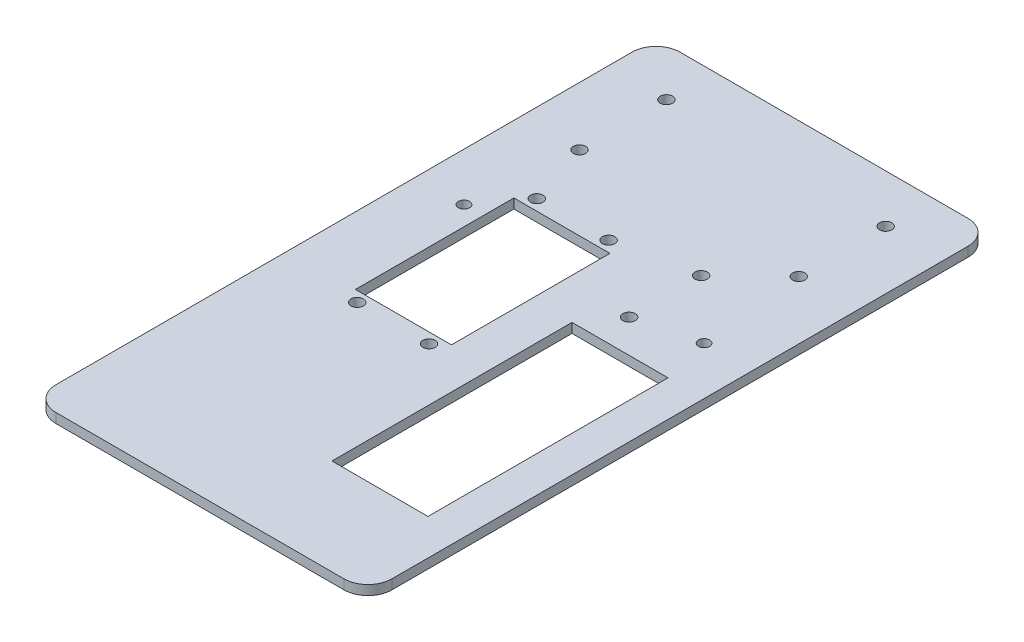
ISO-10303-21;
HEADER;
FILE_DESCRIPTION(('STEP AP214'),'2;1');
FILE_NAME('part.step','',(''),(''),'','','');
FILE_SCHEMA(('AUTOMOTIVE_DESIGN { 1 0 10303 214 1 1 1 1 }'));
ENDSEC;
DATA;
#1=APPLICATION_CONTEXT('core data for automotive mechanical design processes');
#2=APPLICATION_PROTOCOL_DEFINITION('international standard','automotive_design',2000,#1);
#3=PRODUCT_CONTEXT('',#1,'mechanical');
#4=PRODUCT('Part','Part','',(#3));
#5=PRODUCT_RELATED_PRODUCT_CATEGORY('part','',(#4));
#6=PRODUCT_DEFINITION_FORMATION('','',#4);
#7=PRODUCT_DEFINITION_CONTEXT('part definition',#1,'design');
#8=PRODUCT_DEFINITION('design','',#6,#7);
#9=PRODUCT_DEFINITION_SHAPE('','',#8);
#10=(LENGTH_UNIT() NAMED_UNIT(*) SI_UNIT(.MILLI.,.METRE.));
#11=(NAMED_UNIT(*) PLANE_ANGLE_UNIT() SI_UNIT($,.RADIAN.));
#12=(NAMED_UNIT(*) SI_UNIT($,.STERADIAN.) SOLID_ANGLE_UNIT());
#13=UNCERTAINTY_MEASURE_WITH_UNIT(LENGTH_MEASURE(1.E-05),#10,'distance_accuracy_value','');
#14=(GEOMETRIC_REPRESENTATION_CONTEXT(3) GLOBAL_UNCERTAINTY_ASSIGNED_CONTEXT((#13)) GLOBAL_UNIT_ASSIGNED_CONTEXT((#10,
#11,#12)) REPRESENTATION_CONTEXT('',''));
#15=CARTESIAN_POINT('',(0.,0.,0.));
#16=DIRECTION('',(0.,0.,1.));
#17=DIRECTION('',(1.,0.,0.));
#18=AXIS2_PLACEMENT_3D('',#15,#16,#17);
#19=CARTESIAN_POINT('',(0.,2.54,0.));
#20=DIRECTION('',(0.,1.,0.));
#21=DIRECTION('',(0.,0.,1.));
#22=AXIS2_PLACEMENT_3D('',#19,#20,#21);
#23=PLANE('',#22);
#24=DIRECTION('',(1.,0.,0.));
#25=VECTOR('',#24,1.);
#26=CARTESIAN_POINT('',(-26.67,2.54,14.745));
#27=LINE('',#26,#25);
#28=CARTESIAN_POINT('',(-26.67,2.54,14.745));
#29=VERTEX_POINT('',#28);
#30=CARTESIAN_POINT('',(-1.26999999999998,2.54,14.745));
#31=VERTEX_POINT('',#30);
#32=EDGE_CURVE('E58',#29,#31,#27,.T.);
#33=ORIENTED_EDGE('',*,*,#32,.F.);
#34=DIRECTION('',(0.,0.,1.));
#35=VECTOR('',#34,1.);
#36=CARTESIAN_POINT('',(-26.67,2.54,-27.165));
#37=LINE('',#36,#35);
#38=CARTESIAN_POINT('',(-26.67,2.54,-27.165));
#39=VERTEX_POINT('',#38);
#40=EDGE_CURVE('E193',#39,#29,#37,.T.);
#41=ORIENTED_EDGE('',*,*,#40,.F.);
#42=DIRECTION('',(1.,0.,0.));
#43=VECTOR('',#42,1.);
#44=CARTESIAN_POINT('',(-26.67,2.54,-27.165));
#45=LINE('',#44,#43);
#46=CARTESIAN_POINT('',(-1.26999999999999,2.54,-27.165));
#47=VERTEX_POINT('',#46);
#48=EDGE_CURVE('E201',#39,#47,#45,.T.);
#49=ORIENTED_EDGE('',*,*,#48,.T.);
#50=DIRECTION('',(0.,0.,1.));
#51=VECTOR('',#50,1.);
#52=CARTESIAN_POINT('',(-1.26999999999999,2.54,-27.165));
#53=LINE('',#52,#51);
#54=EDGE_CURVE('E204',#47,#31,#53,.T.);
#55=ORIENTED_EDGE('',*,*,#54,.T.);
#56=EDGE_LOOP('',(#33,#41,#49,#55));
#57=FACE_BOUND('',#56,.T.);
#58=CARTESIAN_POINT('',(-29.,2.54,-69.85));
#59=DIRECTION('',(0.,1.,0.));
#60=DIRECTION('',(0.,0.,1.));
#61=AXIS2_PLACEMENT_3D('',#58,#59,#60);
#62=CIRCLE('',#61,1.63194999999999);
#63=CARTESIAN_POINT('',(-29.,2.54,-68.21805));
#64=VERTEX_POINT('',#63);
#65=EDGE_CURVE('E164',#64,#64,#62,.T.);
#66=ORIENTED_EDGE('',*,*,#65,.F.);
#67=EDGE_LOOP('',(#66));
#68=FACE_BOUND('',#67,.T.);
#69=CARTESIAN_POINT('',(29.,2.54,-69.85));
#70=DIRECTION('',(0.,1.,0.));
#71=DIRECTION('',(0.,0.,1.));
#72=AXIS2_PLACEMENT_3D('',#69,#70,#71);
#73=CIRCLE('',#72,1.63194999999999);
#74=CARTESIAN_POINT('',(29.,2.54,-68.21805));
#75=VERTEX_POINT('',#74);
#76=EDGE_CURVE('E220',#75,#75,#73,.T.);
#77=ORIENTED_EDGE('',*,*,#76,.F.);
#78=EDGE_LOOP('',(#77));
#79=FACE_BOUND('',#78,.T.);
#80=CARTESIAN_POINT('',(29.,2.54,-46.85));
#81=DIRECTION('',(0.,1.,0.));
#82=DIRECTION('',(0.,0.,1.));
#83=AXIS2_PLACEMENT_3D('',#80,#81,#82);
#84=CIRCLE('',#83,1.63194999999999);
#85=CARTESIAN_POINT('',(29.,2.54,-45.21805));
#86=VERTEX_POINT('',#85);
#87=EDGE_CURVE('E226',#86,#86,#84,.T.);
#88=ORIENTED_EDGE('',*,*,#87,.F.);
#89=EDGE_LOOP('',(#88));
#90=FACE_BOUND('',#89,.T.);
#91=CARTESIAN_POINT('',(-29.,2.54,-46.85));
#92=DIRECTION('',(0.,1.,0.));
#93=DIRECTION('',(0.,0.,1.));
#94=AXIS2_PLACEMENT_3D('',#91,#92,#93);
#95=CIRCLE('',#94,1.63194999999999);
#96=CARTESIAN_POINT('',(-29.,2.54,-45.21805));
#97=VERTEX_POINT('',#96);
#98=EDGE_CURVE('E232',#97,#97,#95,.T.);
#99=ORIENTED_EDGE('',*,*,#98,.F.);
#100=EDGE_LOOP('',(#99));
#101=FACE_BOUND('',#100,.T.);
#102=CARTESIAN_POINT('',(-23.47,2.54,-30.0225));
#103=DIRECTION('',(0.,1.,0.));
#104=DIRECTION('',(0.,0.,1.));
#105=AXIS2_PLACEMENT_3D('',#102,#103,#104);
#106=CIRCLE('',#105,1.63194999999999);
#107=CARTESIAN_POINT('',(-23.47,2.54,-28.39055));
#108=VERTEX_POINT('',#107);
#109=EDGE_CURVE('E238',#108,#108,#106,.T.);
#110=ORIENTED_EDGE('',*,*,#109,.F.);
#111=EDGE_LOOP('',(#110));
#112=FACE_BOUND('',#111,.T.);
#113=CARTESIAN_POINT('',(-4.46999999999999,2.54,-30.0225));
#114=DIRECTION('',(0.,1.,0.));
#115=DIRECTION('',(0.,0.,1.));
#116=AXIS2_PLACEMENT_3D('',#113,#114,#115);
#117=CIRCLE('',#116,1.63194999999999);
#118=CARTESIAN_POINT('',(-4.46999999999999,2.54,-28.39055));
#119=VERTEX_POINT('',#118);
#120=EDGE_CURVE('E244',#119,#119,#117,.T.);
#121=ORIENTED_EDGE('',*,*,#120,.F.);
#122=EDGE_LOOP('',(#121));
#123=FACE_BOUND('',#122,.T.);
#124=CARTESIAN_POINT('',(-4.46999999999998,2.54,17.4775));
#125=DIRECTION('',(0.,1.,0.));
#126=DIRECTION('',(0.,0.,1.));
#127=AXIS2_PLACEMENT_3D('',#124,#125,#126);
#128=CIRCLE('',#127,1.63194999999999);
#129=CARTESIAN_POINT('',(-4.46999999999998,2.54,19.10945));
#130=VERTEX_POINT('',#129);
#131=EDGE_CURVE('E250',#130,#130,#128,.T.);
#132=ORIENTED_EDGE('',*,*,#131,.F.);
#133=EDGE_LOOP('',(#132));
#134=FACE_BOUND('',#133,.T.);
#135=CARTESIAN_POINT('',(-23.47,2.54,17.4775));
#136=DIRECTION('',(0.,1.,0.));
#137=DIRECTION('',(0.,0.,1.));
#138=AXIS2_PLACEMENT_3D('',#135,#136,#137);
#139=CIRCLE('',#138,1.63194999999999);
#140=CARTESIAN_POINT('',(-23.47,2.54,19.10945));
#141=VERTEX_POINT('',#140);
#142=EDGE_CURVE('E256',#141,#141,#139,.T.);
#143=ORIENTED_EDGE('',*,*,#142,.F.);
#144=EDGE_LOOP('',(#143));
#145=FACE_BOUND('',#144,.T.);
#146=CARTESIAN_POINT('',(15.875,2.54,-34.15));
#147=DIRECTION('',(0.,1.,0.));
#148=DIRECTION('',(0.,0.,1.));
#149=AXIS2_PLACEMENT_3D('',#146,#147,#148);
#150=CIRCLE('',#149,1.63194999999999);
#151=CARTESIAN_POINT('',(15.875,2.54,-32.51805));
#152=VERTEX_POINT('',#151);
#153=EDGE_CURVE('E262',#152,#152,#150,.T.);
#154=ORIENTED_EDGE('',*,*,#153,.F.);
#155=EDGE_LOOP('',(#154));
#156=FACE_BOUND('',#155,.T.);
#157=CARTESIAN_POINT('',(15.875,2.54,-15.1));
#158=DIRECTION('',(0.,1.,0.));
#159=DIRECTION('',(0.,0.,1.));
#160=AXIS2_PLACEMENT_3D('',#157,#158,#159);
#161=CIRCLE('',#160,1.63194999999999);
#162=CARTESIAN_POINT('',(15.875,2.54,-13.46805));
#163=VERTEX_POINT('',#162);
#164=EDGE_CURVE('E268',#163,#163,#161,.T.);
#165=ORIENTED_EDGE('',*,*,#164,.F.);
#166=EDGE_LOOP('',(#165));
#167=FACE_BOUND('',#166,.T.);
#168=CARTESIAN_POINT('',(31.75,2.54,-19.05));
#169=DIRECTION('',(0.,1.,0.));
#170=DIRECTION('',(0.,0.,1.));
#171=AXIS2_PLACEMENT_3D('',#168,#169,#170);
#172=CIRCLE('',#171,1.4732);
#173=CARTESIAN_POINT('',(31.75,2.54,-17.5768));
#174=VERTEX_POINT('',#173);
#175=EDGE_CURVE('E275',#174,#174,#172,.T.);
#176=ORIENTED_EDGE('',*,*,#175,.F.);
#177=EDGE_LOOP('',(#176));
#178=FACE_BOUND('',#177,.T.);
#179=CARTESIAN_POINT('',(-31.75,2.54,-19.05));
#180=DIRECTION('',(0.,1.,0.));
#181=DIRECTION('',(0.,0.,1.));
#182=AXIS2_PLACEMENT_3D('',#179,#180,#181);
#183=CIRCLE('',#182,1.4732);
#184=CARTESIAN_POINT('',(-31.75,2.54,-17.5768));
#185=VERTEX_POINT('',#184);
#186=EDGE_CURVE('E278',#185,#185,#183,.T.);
#187=ORIENTED_EDGE('',*,*,#186,.F.);
#188=EDGE_LOOP('',(#187));
#189=FACE_BOUND('',#188,.T.);
#190=CARTESIAN_POINT('',(-38.1,2.54,-76.2));
#191=DIRECTION('',(0.,1.,0.));
#192=DIRECTION('',(0.,0.,1.));
#193=AXIS2_PLACEMENT_3D('',#190,#191,#192);
#194=CIRCLE('',#193,6.35);
#195=CARTESIAN_POINT('',(-44.45,2.54,-76.1999999999999));
#196=VERTEX_POINT('',#195);
#197=CARTESIAN_POINT('',(-38.0999999999999,2.54,-82.55));
#198=VERTEX_POINT('',#197);
#199=EDGE_CURVE('E282',#196,#198,#194,.F.);
#200=ORIENTED_EDGE('',*,*,#199,.F.);
#201=DIRECTION('',(0.,0.,-1.));
#202=VECTOR('',#201,1.);
#203=CARTESIAN_POINT('',(-44.45,2.54,0.));
#204=LINE('',#203,#202);
#205=CARTESIAN_POINT('',(-44.45,2.54,76.2));
#206=VERTEX_POINT('',#205);
#207=EDGE_CURVE('E285',#206,#196,#204,.T.);
#208=ORIENTED_EDGE('',*,*,#207,.F.);
#209=CARTESIAN_POINT('',(-38.1,2.54,76.2));
#210=DIRECTION('',(0.,1.,0.));
#211=DIRECTION('',(0.,0.,1.));
#212=AXIS2_PLACEMENT_3D('',#209,#210,#211);
#213=CIRCLE('',#212,6.35);
#214=CARTESIAN_POINT('',(-38.0999999999999,2.54,82.55));
#215=VERTEX_POINT('',#214);
#216=EDGE_CURVE('E288',#215,#206,#213,.F.);
#217=ORIENTED_EDGE('',*,*,#216,.F.);
#218=DIRECTION('',(1.,0.,0.));
#219=VECTOR('',#218,1.);
#220=CARTESIAN_POINT('',(0.,2.54,82.55));
#221=LINE('',#220,#219);
#222=CARTESIAN_POINT('',(38.1,2.54,82.55));
#223=VERTEX_POINT('',#222);
#224=EDGE_CURVE('E291',#215,#223,#221,.T.);
#225=ORIENTED_EDGE('',*,*,#224,.T.);
#226=CARTESIAN_POINT('',(38.1,2.54,76.2));
#227=DIRECTION('',(0.,1.,0.));
#228=DIRECTION('',(0.,0.,1.));
#229=AXIS2_PLACEMENT_3D('',#226,#227,#228);
#230=CIRCLE('',#229,6.35);
#231=CARTESIAN_POINT('',(44.45,2.54,76.2));
#232=VERTEX_POINT('',#231);
#233=EDGE_CURVE('E294',#223,#232,#230,.T.);
#234=ORIENTED_EDGE('',*,*,#233,.T.);
#235=DIRECTION('',(0.,0.,-1.));
#236=VECTOR('',#235,1.);
#237=CARTESIAN_POINT('',(44.45,2.54,0.));
#238=LINE('',#237,#236);
#239=CARTESIAN_POINT('',(44.45,2.54,-76.1999999999999));
#240=VERTEX_POINT('',#239);
#241=EDGE_CURVE('E297',#232,#240,#238,.T.);
#242=ORIENTED_EDGE('',*,*,#241,.T.);
#243=CARTESIAN_POINT('',(38.1,2.54,-76.2));
#244=DIRECTION('',(0.,1.,0.));
#245=DIRECTION('',(0.,0.,1.));
#246=AXIS2_PLACEMENT_3D('',#243,#244,#245);
#247=CIRCLE('',#246,6.35);
#248=CARTESIAN_POINT('',(38.1,2.54,-82.55));
#249=VERTEX_POINT('',#248);
#250=EDGE_CURVE('E299',#249,#240,#247,.F.);
#251=ORIENTED_EDGE('',*,*,#250,.F.);
#252=DIRECTION('',(1.,0.,0.));
#253=VECTOR('',#252,1.);
#254=CARTESIAN_POINT('',(0.,2.54,-82.55));
#255=LINE('',#254,#253);
#256=EDGE_CURVE('E302',#198,#249,#255,.T.);
#257=ORIENTED_EDGE('',*,*,#256,.F.);
#258=EDGE_LOOP('',(#200,#208,#217,#225,#234,#242,#251,#257));
#259=FACE_BOUND('',#258,.T.);
#260=DIRECTION('',(0.,0.,1.));
#261=VECTOR('',#260,1.);
#262=CARTESIAN_POINT('',(9.525,2.54,-6.34999999999999));
#263=LINE('',#262,#261);
#264=CARTESIAN_POINT('',(9.525,2.54,-6.34999999999999));
#265=VERTEX_POINT('',#264);
#266=CARTESIAN_POINT('',(9.52500000000001,2.54,57.15));
#267=VERTEX_POINT('',#266);
#268=EDGE_CURVE('E156',#265,#267,#263,.T.);
#269=ORIENTED_EDGE('',*,*,#268,.F.);
#270=DIRECTION('',(1.,0.,0.));
#271=VECTOR('',#270,1.);
#272=CARTESIAN_POINT('',(9.525,2.54,-6.34999999999999));
#273=LINE('',#272,#271);
#274=CARTESIAN_POINT('',(34.925,2.54,-6.34999999999999));
#275=VERTEX_POINT('',#274);
#276=EDGE_CURVE('E50',#265,#275,#273,.T.);
#277=ORIENTED_EDGE('',*,*,#276,.T.);
#278=DIRECTION('',(0.,0.,1.));
#279=VECTOR('',#278,1.);
#280=CARTESIAN_POINT('',(34.925,2.54,-6.34999999999999));
#281=LINE('',#280,#279);
#282=CARTESIAN_POINT('',(34.925,2.54,57.15));
#283=VERTEX_POINT('',#282);
#284=EDGE_CURVE('E171',#275,#283,#281,.T.);
#285=ORIENTED_EDGE('',*,*,#284,.T.);
#286=DIRECTION('',(1.,0.,0.));
#287=VECTOR('',#286,1.);
#288=CARTESIAN_POINT('',(9.52500000000001,2.54,57.15));
#289=LINE('',#288,#287);
#290=EDGE_CURVE('E179',#267,#283,#289,.T.);
#291=ORIENTED_EDGE('',*,*,#290,.F.);
#292=EDGE_LOOP('',(#269,#277,#285,#291));
#293=FACE_BOUND('',#292,.T.);
#294=ADVANCED_FACE('F35',(#57,#68,#79,#90,#101,#112,#123,#134,#145,#156,#167,#178,#189,#259,
#293),#23,.T.);
#295=CARTESIAN_POINT('',(0.,0.,0.));
#296=DIRECTION('',(0.,1.,0.));
#297=DIRECTION('',(0.,0.,1.));
#298=AXIS2_PLACEMENT_3D('',#295,#296,#297);
#299=PLANE('',#298);
#300=CARTESIAN_POINT('',(-38.1,0.,-76.2));
#301=DIRECTION('',(0.,1.,0.));
#302=DIRECTION('',(0.,0.,1.));
#303=AXIS2_PLACEMENT_3D('',#300,#301,#302);
#304=CIRCLE('',#303,6.35);
#305=CARTESIAN_POINT('',(-44.45,0.,-76.1999999999999));
#306=VERTEX_POINT('',#305);
#307=CARTESIAN_POINT('',(-38.0999999999999,0.,-82.55));
#308=VERTEX_POINT('',#307);
#309=EDGE_CURVE('E311',#306,#308,#304,.F.);
#310=ORIENTED_EDGE('',*,*,#309,.T.);
#311=DIRECTION('',(1.,0.,0.));
#312=VECTOR('',#311,1.);
#313=CARTESIAN_POINT('',(0.,0.,-82.55));
#314=LINE('',#313,#312);
#315=CARTESIAN_POINT('',(38.1,0.,-82.55));
#316=VERTEX_POINT('',#315);
#317=EDGE_CURVE('E279',#308,#316,#314,.T.);
#318=ORIENTED_EDGE('',*,*,#317,.T.);
#319=CARTESIAN_POINT('',(38.1,0.,-76.2));
#320=DIRECTION('',(0.,1.,0.));
#321=DIRECTION('',(0.,0.,1.));
#322=AXIS2_PLACEMENT_3D('',#319,#320,#321);
#323=CIRCLE('',#322,6.35);
#324=CARTESIAN_POINT('',(44.45,0.,-76.1999999999999));
#325=VERTEX_POINT('',#324);
#326=EDGE_CURVE('E329',#316,#325,#323,.F.);
#327=ORIENTED_EDGE('',*,*,#326,.T.);
#328=DIRECTION('',(0.,0.,-1.));
#329=VECTOR('',#328,1.);
#330=CARTESIAN_POINT('',(44.45,0.,0.));
#331=LINE('',#330,#329);
#332=CARTESIAN_POINT('',(44.45,0.,76.2));
#333=VERTEX_POINT('',#332);
#334=EDGE_CURVE('E326',#333,#325,#331,.T.);
#335=ORIENTED_EDGE('',*,*,#334,.F.);
#336=CARTESIAN_POINT('',(38.1,0.,76.2));
#337=DIRECTION('',(0.,1.,0.));
#338=DIRECTION('',(0.,0.,1.));
#339=AXIS2_PLACEMENT_3D('',#336,#337,#338);
#340=CIRCLE('',#339,6.35);
#341=CARTESIAN_POINT('',(38.1,0.,82.55));
#342=VERTEX_POINT('',#341);
#343=EDGE_CURVE('E323',#342,#333,#340,.T.);
#344=ORIENTED_EDGE('',*,*,#343,.F.);
#345=DIRECTION('',(1.,0.,0.));
#346=VECTOR('',#345,1.);
#347=CARTESIAN_POINT('',(0.,0.,82.55));
#348=LINE('',#347,#346);
#349=CARTESIAN_POINT('',(-38.0999999999999,0.,82.55));
#350=VERTEX_POINT('',#349);
#351=EDGE_CURVE('E320',#350,#342,#348,.T.);
#352=ORIENTED_EDGE('',*,*,#351,.F.);
#353=CARTESIAN_POINT('',(-38.1,0.,76.2));
#354=DIRECTION('',(0.,1.,0.));
#355=DIRECTION('',(0.,0.,1.));
#356=AXIS2_PLACEMENT_3D('',#353,#354,#355);
#357=CIRCLE('',#356,6.35);
#358=CARTESIAN_POINT('',(-44.45,0.,76.2));
#359=VERTEX_POINT('',#358);
#360=EDGE_CURVE('E317',#350,#359,#357,.F.);
#361=ORIENTED_EDGE('',*,*,#360,.T.);
#362=DIRECTION('',(0.,0.,-1.));
#363=VECTOR('',#362,1.);
#364=CARTESIAN_POINT('',(-44.45,0.,0.));
#365=LINE('',#364,#363);
#366=EDGE_CURVE('E314',#359,#306,#365,.T.);
#367=ORIENTED_EDGE('',*,*,#366,.T.);
#368=EDGE_LOOP('',(#310,#318,#327,#335,#344,#352,#361,#367));
#369=FACE_BOUND('',#368,.T.);
#370=CARTESIAN_POINT('',(-31.75,0.,-19.05));
#371=DIRECTION('',(0.,1.,0.));
#372=DIRECTION('',(0.,0.,1.));
#373=AXIS2_PLACEMENT_3D('',#370,#371,#372);
#374=CIRCLE('',#373,1.4732);
#375=CARTESIAN_POINT('',(-31.75,0.,-17.5768));
#376=VERTEX_POINT('',#375);
#377=EDGE_CURVE('E308',#376,#376,#374,.T.);
#378=ORIENTED_EDGE('',*,*,#377,.T.);
#379=EDGE_LOOP('',(#378));
#380=FACE_BOUND('',#379,.T.);
#381=CARTESIAN_POINT('',(31.75,0.,-19.05));
#382=DIRECTION('',(0.,1.,0.));
#383=DIRECTION('',(0.,0.,1.));
#384=AXIS2_PLACEMENT_3D('',#381,#382,#383);
#385=CIRCLE('',#384,1.4732);
#386=CARTESIAN_POINT('',(31.75,0.,-17.5768));
#387=VERTEX_POINT('',#386);
#388=EDGE_CURVE('E274',#387,#387,#385,.T.);
#389=ORIENTED_EDGE('',*,*,#388,.T.);
#390=EDGE_LOOP('',(#389));
#391=FACE_BOUND('',#390,.T.);
#392=CARTESIAN_POINT('',(15.875,0.,-15.1));
#393=DIRECTION('',(0.,1.,0.));
#394=DIRECTION('',(0.,0.,1.));
#395=AXIS2_PLACEMENT_3D('',#392,#393,#394);
#396=CIRCLE('',#395,1.63194999999999);
#397=CARTESIAN_POINT('',(15.875,0.,-13.46805));
#398=VERTEX_POINT('',#397);
#399=EDGE_CURVE('E271',#398,#398,#396,.T.);
#400=ORIENTED_EDGE('',*,*,#399,.T.);
#401=EDGE_LOOP('',(#400));
#402=FACE_BOUND('',#401,.T.);
#403=CARTESIAN_POINT('',(15.875,0.,-34.15));
#404=DIRECTION('',(0.,1.,0.));
#405=DIRECTION('',(0.,0.,1.));
#406=AXIS2_PLACEMENT_3D('',#403,#404,#405);
#407=CIRCLE('',#406,1.63194999999999);
#408=CARTESIAN_POINT('',(15.875,0.,-32.51805));
#409=VERTEX_POINT('',#408);
#410=EDGE_CURVE('E265',#409,#409,#407,.T.);
#411=ORIENTED_EDGE('',*,*,#410,.T.);
#412=EDGE_LOOP('',(#411));
#413=FACE_BOUND('',#412,.T.);
#414=CARTESIAN_POINT('',(-23.47,0.,17.4775));
#415=DIRECTION('',(0.,1.,0.));
#416=DIRECTION('',(0.,0.,1.));
#417=AXIS2_PLACEMENT_3D('',#414,#415,#416);
#418=CIRCLE('',#417,1.63194999999999);
#419=CARTESIAN_POINT('',(-23.47,0.,19.10945));
#420=VERTEX_POINT('',#419);
#421=EDGE_CURVE('E259',#420,#420,#418,.T.);
#422=ORIENTED_EDGE('',*,*,#421,.T.);
#423=EDGE_LOOP('',(#422));
#424=FACE_BOUND('',#423,.T.);
#425=CARTESIAN_POINT('',(-4.46999999999998,0.,17.4775));
#426=DIRECTION('',(0.,1.,0.));
#427=DIRECTION('',(0.,0.,1.));
#428=AXIS2_PLACEMENT_3D('',#425,#426,#427);
#429=CIRCLE('',#428,1.63194999999999);
#430=CARTESIAN_POINT('',(-4.46999999999998,0.,19.10945));
#431=VERTEX_POINT('',#430);
#432=EDGE_CURVE('E253',#431,#431,#429,.T.);
#433=ORIENTED_EDGE('',*,*,#432,.T.);
#434=EDGE_LOOP('',(#433));
#435=FACE_BOUND('',#434,.T.);
#436=CARTESIAN_POINT('',(-4.46999999999999,0.,-30.0225));
#437=DIRECTION('',(0.,1.,0.));
#438=DIRECTION('',(0.,0.,1.));
#439=AXIS2_PLACEMENT_3D('',#436,#437,#438);
#440=CIRCLE('',#439,1.63194999999999);
#441=CARTESIAN_POINT('',(-4.46999999999999,0.,-28.39055));
#442=VERTEX_POINT('',#441);
#443=EDGE_CURVE('E247',#442,#442,#440,.T.);
#444=ORIENTED_EDGE('',*,*,#443,.T.);
#445=EDGE_LOOP('',(#444));
#446=FACE_BOUND('',#445,.T.);
#447=CARTESIAN_POINT('',(-23.47,0.,-30.0225));
#448=DIRECTION('',(0.,1.,0.));
#449=DIRECTION('',(0.,0.,1.));
#450=AXIS2_PLACEMENT_3D('',#447,#448,#449);
#451=CIRCLE('',#450,1.63194999999999);
#452=CARTESIAN_POINT('',(-23.47,0.,-28.39055));
#453=VERTEX_POINT('',#452);
#454=EDGE_CURVE('E241',#453,#453,#451,.T.);
#455=ORIENTED_EDGE('',*,*,#454,.T.);
#456=EDGE_LOOP('',(#455));
#457=FACE_BOUND('',#456,.T.);
#458=CARTESIAN_POINT('',(-29.,0.,-46.85));
#459=DIRECTION('',(0.,1.,0.));
#460=DIRECTION('',(0.,0.,1.));
#461=AXIS2_PLACEMENT_3D('',#458,#459,#460);
#462=CIRCLE('',#461,1.63194999999999);
#463=CARTESIAN_POINT('',(-29.,0.,-45.21805));
#464=VERTEX_POINT('',#463);
#465=EDGE_CURVE('E235',#464,#464,#462,.T.);
#466=ORIENTED_EDGE('',*,*,#465,.T.);
#467=EDGE_LOOP('',(#466));
#468=FACE_BOUND('',#467,.T.);
#469=CARTESIAN_POINT('',(29.,0.,-46.85));
#470=DIRECTION('',(0.,1.,0.));
#471=DIRECTION('',(0.,0.,1.));
#472=AXIS2_PLACEMENT_3D('',#469,#470,#471);
#473=CIRCLE('',#472,1.63194999999999);
#474=CARTESIAN_POINT('',(29.,0.,-45.21805));
#475=VERTEX_POINT('',#474);
#476=EDGE_CURVE('E229',#475,#475,#473,.T.);
#477=ORIENTED_EDGE('',*,*,#476,.T.);
#478=EDGE_LOOP('',(#477));
#479=FACE_BOUND('',#478,.T.);
#480=CARTESIAN_POINT('',(29.,0.,-69.85));
#481=DIRECTION('',(0.,1.,0.));
#482=DIRECTION('',(0.,0.,1.));
#483=AXIS2_PLACEMENT_3D('',#480,#481,#482);
#484=CIRCLE('',#483,1.63194999999999);
#485=CARTESIAN_POINT('',(29.,0.,-68.21805));
#486=VERTEX_POINT('',#485);
#487=EDGE_CURVE('E223',#486,#486,#484,.T.);
#488=ORIENTED_EDGE('',*,*,#487,.T.);
#489=EDGE_LOOP('',(#488));
#490=FACE_BOUND('',#489,.T.);
#491=CARTESIAN_POINT('',(-29.,0.,-69.85));
#492=DIRECTION('',(0.,1.,0.));
#493=DIRECTION('',(0.,0.,1.));
#494=AXIS2_PLACEMENT_3D('',#491,#492,#493);
#495=CIRCLE('',#494,1.63194999999999);
#496=CARTESIAN_POINT('',(-29.,0.,-68.21805));
#497=VERTEX_POINT('',#496);
#498=EDGE_CURVE('E217',#497,#497,#495,.T.);
#499=ORIENTED_EDGE('',*,*,#498,.T.);
#500=EDGE_LOOP('',(#499));
#501=FACE_BOUND('',#500,.T.);
#502=DIRECTION('',(0.,0.,-1.));
#503=VECTOR('',#502,1.);
#504=CARTESIAN_POINT('',(-26.67,0.,-27.165));
#505=LINE('',#504,#503);
#506=CARTESIAN_POINT('',(-26.67,0.,14.745));
#507=VERTEX_POINT('',#506);
#508=CARTESIAN_POINT('',(-26.67,0.,-27.165));
#509=VERTEX_POINT('',#508);
#510=EDGE_CURVE('E210',#507,#509,#505,.T.);
#511=ORIENTED_EDGE('',*,*,#510,.F.);
#512=DIRECTION('',(-1.,0.,0.));
#513=VECTOR('',#512,1.);
#514=CARTESIAN_POINT('',(-26.67,0.,14.745));
#515=LINE('',#514,#513);
#516=CARTESIAN_POINT('',(-1.26999999999998,0.,14.745));
#517=VERTEX_POINT('',#516);
#518=EDGE_CURVE('E208',#517,#507,#515,.T.);
#519=ORIENTED_EDGE('',*,*,#518,.F.);
#520=DIRECTION('',(0.,0.,-1.));
#521=VECTOR('',#520,1.);
#522=CARTESIAN_POINT('',(-1.26999999999999,0.,-27.165));
#523=LINE('',#522,#521);
#524=CARTESIAN_POINT('',(-1.26999999999999,0.,-27.165));
#525=VERTEX_POINT('',#524);
#526=EDGE_CURVE('E187',#517,#525,#523,.T.);
#527=ORIENTED_EDGE('',*,*,#526,.T.);
#528=DIRECTION('',(-1.,0.,0.));
#529=VECTOR('',#528,1.);
#530=CARTESIAN_POINT('',(-26.67,0.,-27.165));
#531=LINE('',#530,#529);
#532=EDGE_CURVE('E212',#525,#509,#531,.T.);
#533=ORIENTED_EDGE('',*,*,#532,.T.);
#534=EDGE_LOOP('',(#511,#519,#527,#533));
#535=FACE_BOUND('',#534,.T.);
#536=DIRECTION('',(-1.,0.,0.));
#537=VECTOR('',#536,1.);
#538=CARTESIAN_POINT('',(9.525,0.,-6.34999999999999));
#539=LINE('',#538,#537);
#540=CARTESIAN_POINT('',(34.925,0.,-6.34999999999999));
#541=VERTEX_POINT('',#540);
#542=CARTESIAN_POINT('',(9.525,0.,-6.34999999999999));
#543=VERTEX_POINT('',#542);
#544=EDGE_CURVE('E150',#541,#543,#539,.T.);
#545=ORIENTED_EDGE('',*,*,#544,.T.);
#546=DIRECTION('',(0.,0.,-1.));
#547=VECTOR('',#546,1.);
#548=CARTESIAN_POINT('',(9.525,0.,-6.34999999999999));
#549=LINE('',#548,#547);
#550=CARTESIAN_POINT('',(9.52500000000001,0.,57.15));
#551=VERTEX_POINT('',#550);
#552=EDGE_CURVE('E160',#551,#543,#549,.T.);
#553=ORIENTED_EDGE('',*,*,#552,.F.);
#554=DIRECTION('',(-1.,0.,0.));
#555=VECTOR('',#554,1.);
#556=CARTESIAN_POINT('',(9.52500000000001,0.,57.15));
#557=LINE('',#556,#555);
#558=CARTESIAN_POINT('',(34.925,0.,57.15));
#559=VERTEX_POINT('',#558);
#560=EDGE_CURVE('E173',#559,#551,#557,.T.);
#561=ORIENTED_EDGE('',*,*,#560,.F.);
#562=DIRECTION('',(0.,0.,-1.));
#563=VECTOR('',#562,1.);
#564=CARTESIAN_POINT('',(34.925,0.,-6.34999999999999));
#565=LINE('',#564,#563);
#566=EDGE_CURVE('E169',#559,#541,#565,.T.);
#567=ORIENTED_EDGE('',*,*,#566,.T.);
#568=EDGE_LOOP('',(#545,#553,#561,#567));
#569=FACE_BOUND('',#568,.T.);
#570=ADVANCED_FACE('F167',(#369,#380,#391,#402,#413,#424,#435,#446,#457,#468,#479,#490,#501,
#535,#569),#299,.F.);
#571=CARTESIAN_POINT('',(-38.1,2.54,-76.2));
#572=DIRECTION('',(0.,-1.,0.));
#573=DIRECTION('',(0.,0.,-1.));
#574=AXIS2_PLACEMENT_3D('',#571,#572,#573);
#575=CYLINDRICAL_SURFACE('',#574,6.35);
#576=ORIENTED_EDGE('',*,*,#309,.F.);
#577=DIRECTION('',(0.,-1.,0.));
#578=VECTOR('',#577,1.);
#579=CARTESIAN_POINT('',(-44.45,2.54,-76.1999999999999));
#580=LINE('',#579,#578);
#581=EDGE_CURVE('E11',#196,#306,#580,.T.);
#582=ORIENTED_EDGE('',*,*,#581,.F.);
#583=ORIENTED_EDGE('',*,*,#199,.T.);
#584=DIRECTION('',(0.,-1.,0.));
#585=VECTOR('',#584,1.);
#586=CARTESIAN_POINT('',(-38.0999999999999,2.54,-82.55));
#587=LINE('',#586,#585);
#588=EDGE_CURVE('E305',#198,#308,#587,.T.);
#589=ORIENTED_EDGE('',*,*,#588,.T.);
#590=EDGE_LOOP('',(#576,#582,#583,#589));
#591=FACE_BOUND('',#590,.T.);
#592=ADVANCED_FACE('F368',(#591),#575,.T.);
#593=CARTESIAN_POINT('',(-44.45,2.54,0.));
#594=DIRECTION('',(-1.,0.,0.));
#595=DIRECTION('',(0.,0.,1.));
#596=AXIS2_PLACEMENT_3D('',#593,#594,#595);
#597=PLANE('',#596);
#598=ORIENTED_EDGE('',*,*,#366,.F.);
#599=DIRECTION('',(0.,-1.,0.));
#600=VECTOR('',#599,1.);
#601=CARTESIAN_POINT('',(-44.45,2.54,76.2));
#602=LINE('',#601,#600);
#603=EDGE_CURVE('E43',#206,#359,#602,.T.);
#604=ORIENTED_EDGE('',*,*,#603,.F.);
#605=ORIENTED_EDGE('',*,*,#207,.T.);
#606=ORIENTED_EDGE('',*,*,#581,.T.);
#607=EDGE_LOOP('',(#598,#604,#605,#606));
#608=FACE_BOUND('',#607,.T.);
#609=ADVANCED_FACE('F353',(#608),#597,.T.);
#610=CARTESIAN_POINT('',(-38.1,2.54,76.2));
#611=DIRECTION('',(0.,-1.,0.));
#612=DIRECTION('',(0.,0.,-1.));
#613=AXIS2_PLACEMENT_3D('',#610,#611,#612);
#614=CYLINDRICAL_SURFACE('',#613,6.35);
#615=ORIENTED_EDGE('',*,*,#360,.F.);
#616=DIRECTION('',(0.,-1.,0.));
#617=VECTOR('',#616,1.);
#618=CARTESIAN_POINT('',(-38.0999999999999,2.54,82.55));
#619=LINE('',#618,#617);
#620=EDGE_CURVE('E345',#215,#350,#619,.T.);
#621=ORIENTED_EDGE('',*,*,#620,.F.);
#622=ORIENTED_EDGE('',*,*,#216,.T.);
#623=ORIENTED_EDGE('',*,*,#603,.T.);
#624=EDGE_LOOP('',(#615,#621,#622,#623));
#625=FACE_BOUND('',#624,.T.);
#626=ADVANCED_FACE('F349',(#625),#614,.T.);
#627=CARTESIAN_POINT('',(0.,2.54,82.55));
#628=DIRECTION('',(0.,0.,-1.));
#629=DIRECTION('',(-1.,0.,0.));
#630=AXIS2_PLACEMENT_3D('',#627,#628,#629);
#631=PLANE('',#630);
#632=ORIENTED_EDGE('',*,*,#351,.T.);
#633=DIRECTION('',(0.,-1.,0.));
#634=VECTOR('',#633,1.);
#635=CARTESIAN_POINT('',(38.1,2.54,82.55));
#636=LINE('',#635,#634);
#637=EDGE_CURVE('E342',#223,#342,#636,.T.);
#638=ORIENTED_EDGE('',*,*,#637,.F.);
#639=ORIENTED_EDGE('',*,*,#224,.F.);
#640=ORIENTED_EDGE('',*,*,#620,.T.);
#641=EDGE_LOOP('',(#632,#638,#639,#640));
#642=FACE_BOUND('',#641,.T.);
#643=ADVANCED_FACE('F360',(#642),#631,.F.);
#644=CARTESIAN_POINT('',(38.1,2.54,76.2));
#645=DIRECTION('',(0.,-1.,0.));
#646=DIRECTION('',(0.,0.,-1.));
#647=AXIS2_PLACEMENT_3D('',#644,#645,#646);
#648=CYLINDRICAL_SURFACE('',#647,6.35);
#649=ORIENTED_EDGE('',*,*,#343,.T.);
#650=DIRECTION('',(0.,-1.,0.));
#651=VECTOR('',#650,1.);
#652=CARTESIAN_POINT('',(44.45,2.54,76.2));
#653=LINE('',#652,#651);
#654=EDGE_CURVE('E339',#232,#333,#653,.T.);
#655=ORIENTED_EDGE('',*,*,#654,.F.);
#656=ORIENTED_EDGE('',*,*,#233,.F.);
#657=ORIENTED_EDGE('',*,*,#637,.T.);
#658=EDGE_LOOP('',(#649,#655,#656,#657));
#659=FACE_BOUND('',#658,.T.);
#660=ADVANCED_FACE('F380',(#659),#648,.T.);
#661=CARTESIAN_POINT('',(44.45,2.54,0.));
#662=DIRECTION('',(-1.,0.,0.));
#663=DIRECTION('',(0.,0.,1.));
#664=AXIS2_PLACEMENT_3D('',#661,#662,#663);
#665=PLANE('',#664);
#666=ORIENTED_EDGE('',*,*,#334,.T.);
#667=DIRECTION('',(0.,-1.,0.));
#668=VECTOR('',#667,1.);
#669=CARTESIAN_POINT('',(44.45,2.54,-76.1999999999999));
#670=LINE('',#669,#668);
#671=EDGE_CURVE('E337',#240,#325,#670,.T.);
#672=ORIENTED_EDGE('',*,*,#671,.F.);
#673=ORIENTED_EDGE('',*,*,#241,.F.);
#674=ORIENTED_EDGE('',*,*,#654,.T.);
#675=EDGE_LOOP('',(#666,#672,#673,#674));
#676=FACE_BOUND('',#675,.T.);
#677=ADVANCED_FACE('F378',(#676),#665,.F.);
#678=CARTESIAN_POINT('',(38.1,2.54,-76.2));
#679=DIRECTION('',(0.,-1.,0.));
#680=DIRECTION('',(0.,0.,-1.));
#681=AXIS2_PLACEMENT_3D('',#678,#679,#680);
#682=CYLINDRICAL_SURFACE('',#681,6.35);
#683=ORIENTED_EDGE('',*,*,#326,.F.);
#684=DIRECTION('',(0.,-1.,0.));
#685=VECTOR('',#684,1.);
#686=CARTESIAN_POINT('',(38.1,2.54,-82.55));
#687=LINE('',#686,#685);
#688=EDGE_CURVE('E335',#249,#316,#687,.T.);
#689=ORIENTED_EDGE('',*,*,#688,.F.);
#690=ORIENTED_EDGE('',*,*,#250,.T.);
#691=ORIENTED_EDGE('',*,*,#671,.T.);
#692=EDGE_LOOP('',(#683,#689,#690,#691));
#693=FACE_BOUND('',#692,.T.);
#694=ADVANCED_FACE('F374',(#693),#682,.T.);
#695=CARTESIAN_POINT('',(-31.75,2.54,-19.05));
#696=DIRECTION('',(0.,-1.,0.));
#697=DIRECTION('',(0.,0.,-1.));
#698=AXIS2_PLACEMENT_3D('',#695,#696,#697);
#699=CYLINDRICAL_SURFACE('',#698,1.4732);
#700=ORIENTED_EDGE('',*,*,#186,.T.);
#701=EDGE_LOOP('',(#700));
#702=FACE_BOUND('',#701,.T.);
#703=ORIENTED_EDGE('',*,*,#377,.F.);
#704=EDGE_LOOP('',(#703));
#705=FACE_BOUND('',#704,.T.);
#706=ADVANCED_FACE('F404',(#702,#705),#699,.F.);
#707=CARTESIAN_POINT('',(31.75,2.54,-19.05));
#708=DIRECTION('',(0.,-1.,0.));
#709=DIRECTION('',(0.,0.,-1.));
#710=AXIS2_PLACEMENT_3D('',#707,#708,#709);
#711=CYLINDRICAL_SURFACE('',#710,1.4732);
#712=ORIENTED_EDGE('',*,*,#175,.T.);
#713=EDGE_LOOP('',(#712));
#714=FACE_BOUND('',#713,.T.);
#715=ORIENTED_EDGE('',*,*,#388,.F.);
#716=EDGE_LOOP('',(#715));
#717=FACE_BOUND('',#716,.T.);
#718=ADVANCED_FACE('F37',(#714,#717),#711,.F.);
#719=CARTESIAN_POINT('',(0.,2.54,-82.55));
#720=DIRECTION('',(0.,0.,-1.));
#721=DIRECTION('',(-1.,0.,0.));
#722=AXIS2_PLACEMENT_3D('',#719,#720,#721);
#723=PLANE('',#722);
#724=ORIENTED_EDGE('',*,*,#317,.F.);
#725=ORIENTED_EDGE('',*,*,#588,.F.);
#726=ORIENTED_EDGE('',*,*,#256,.T.);
#727=ORIENTED_EDGE('',*,*,#688,.T.);
#728=EDGE_LOOP('',(#724,#725,#726,#727));
#729=FACE_BOUND('',#728,.T.);
#730=ADVANCED_FACE('F371',(#729),#723,.T.);
#731=CARTESIAN_POINT('',(15.875,2.54,-15.1));
#732=DIRECTION('',(0.,1.,0.));
#733=DIRECTION('',(0.,0.,1.));
#734=AXIS2_PLACEMENT_3D('',#731,#732,#733);
#735=CYLINDRICAL_SURFACE('',#734,1.63194999999999);
#736=ORIENTED_EDGE('',*,*,#399,.F.);
#737=EDGE_LOOP('',(#736));
#738=FACE_BOUND('',#737,.T.);
#739=ORIENTED_EDGE('',*,*,#164,.T.);
#740=EDGE_LOOP('',(#739));
#741=FACE_BOUND('',#740,.T.);
#742=ADVANCED_FACE('F398',(#738,#741),#735,.F.);
#743=CARTESIAN_POINT('',(15.875,2.54,-34.15));
#744=DIRECTION('',(0.,1.,0.));
#745=DIRECTION('',(0.,0.,1.));
#746=AXIS2_PLACEMENT_3D('',#743,#744,#745);
#747=CYLINDRICAL_SURFACE('',#746,1.63194999999999);
#748=ORIENTED_EDGE('',*,*,#410,.F.);
#749=EDGE_LOOP('',(#748));
#750=FACE_BOUND('',#749,.T.);
#751=ORIENTED_EDGE('',*,*,#153,.T.);
#752=EDGE_LOOP('',(#751));
#753=FACE_BOUND('',#752,.T.);
#754=ADVANCED_FACE('F467',(#750,#753),#747,.F.);
#755=CARTESIAN_POINT('',(-23.47,2.54,17.4775));
#756=DIRECTION('',(0.,1.,0.));
#757=DIRECTION('',(0.,0.,1.));
#758=AXIS2_PLACEMENT_3D('',#755,#756,#757);
#759=CYLINDRICAL_SURFACE('',#758,1.63194999999999);
#760=ORIENTED_EDGE('',*,*,#421,.F.);
#761=EDGE_LOOP('',(#760));
#762=FACE_BOUND('',#761,.T.);
#763=ORIENTED_EDGE('',*,*,#142,.T.);
#764=EDGE_LOOP('',(#763));
#765=FACE_BOUND('',#764,.T.);
#766=ADVANCED_FACE('F476',(#762,#765),#759,.F.);
#767=CARTESIAN_POINT('',(-4.46999999999998,2.54,17.4775));
#768=DIRECTION('',(0.,1.,0.));
#769=DIRECTION('',(0.,0.,1.));
#770=AXIS2_PLACEMENT_3D('',#767,#768,#769);
#771=CYLINDRICAL_SURFACE('',#770,1.63194999999999);
#772=ORIENTED_EDGE('',*,*,#432,.F.);
#773=EDGE_LOOP('',(#772));
#774=FACE_BOUND('',#773,.T.);
#775=ORIENTED_EDGE('',*,*,#131,.T.);
#776=EDGE_LOOP('',(#775));
#777=FACE_BOUND('',#776,.T.);
#778=ADVANCED_FACE('F485',(#774,#777),#771,.F.);
#779=CARTESIAN_POINT('',(-4.46999999999999,2.54,-30.0225));
#780=DIRECTION('',(0.,1.,0.));
#781=DIRECTION('',(0.,0.,1.));
#782=AXIS2_PLACEMENT_3D('',#779,#780,#781);
#783=CYLINDRICAL_SURFACE('',#782,1.63194999999999);
#784=ORIENTED_EDGE('',*,*,#443,.F.);
#785=EDGE_LOOP('',(#784));
#786=FACE_BOUND('',#785,.T.);
#787=ORIENTED_EDGE('',*,*,#120,.T.);
#788=EDGE_LOOP('',(#787));
#789=FACE_BOUND('',#788,.T.);
#790=ADVANCED_FACE('F495',(#786,#789),#783,.F.);
#791=CARTESIAN_POINT('',(-23.47,2.54,-30.0225));
#792=DIRECTION('',(0.,1.,0.));
#793=DIRECTION('',(0.,0.,1.));
#794=AXIS2_PLACEMENT_3D('',#791,#792,#793);
#795=CYLINDRICAL_SURFACE('',#794,1.63194999999999);
#796=ORIENTED_EDGE('',*,*,#454,.F.);
#797=EDGE_LOOP('',(#796));
#798=FACE_BOUND('',#797,.T.);
#799=ORIENTED_EDGE('',*,*,#109,.T.);
#800=EDGE_LOOP('',(#799));
#801=FACE_BOUND('',#800,.T.);
#802=ADVANCED_FACE('F505',(#798,#801),#795,.F.);
#803=CARTESIAN_POINT('',(-29.,2.54,-46.85));
#804=DIRECTION('',(0.,1.,0.));
#805=DIRECTION('',(0.,0.,1.));
#806=AXIS2_PLACEMENT_3D('',#803,#804,#805);
#807=CYLINDRICAL_SURFACE('',#806,1.63194999999999);
#808=ORIENTED_EDGE('',*,*,#465,.F.);
#809=EDGE_LOOP('',(#808));
#810=FACE_BOUND('',#809,.T.);
#811=ORIENTED_EDGE('',*,*,#98,.T.);
#812=EDGE_LOOP('',(#811));
#813=FACE_BOUND('',#812,.T.);
#814=ADVANCED_FACE('F515',(#810,#813),#807,.F.);
#815=CARTESIAN_POINT('',(29.,2.54,-46.85));
#816=DIRECTION('',(0.,1.,0.));
#817=DIRECTION('',(0.,0.,1.));
#818=AXIS2_PLACEMENT_3D('',#815,#816,#817);
#819=CYLINDRICAL_SURFACE('',#818,1.63194999999999);
#820=ORIENTED_EDGE('',*,*,#476,.F.);
#821=EDGE_LOOP('',(#820));
#822=FACE_BOUND('',#821,.T.);
#823=ORIENTED_EDGE('',*,*,#87,.T.);
#824=EDGE_LOOP('',(#823));
#825=FACE_BOUND('',#824,.T.);
#826=ADVANCED_FACE('F525',(#822,#825),#819,.F.);
#827=CARTESIAN_POINT('',(29.,2.54,-69.85));
#828=DIRECTION('',(0.,1.,0.));
#829=DIRECTION('',(0.,0.,1.));
#830=AXIS2_PLACEMENT_3D('',#827,#828,#829);
#831=CYLINDRICAL_SURFACE('',#830,1.63194999999999);
#832=ORIENTED_EDGE('',*,*,#487,.F.);
#833=EDGE_LOOP('',(#832));
#834=FACE_BOUND('',#833,.T.);
#835=ORIENTED_EDGE('',*,*,#76,.T.);
#836=EDGE_LOOP('',(#835));
#837=FACE_BOUND('',#836,.T.);
#838=ADVANCED_FACE('F535',(#834,#837),#831,.F.);
#839=CARTESIAN_POINT('',(-29.,2.54,-69.85));
#840=DIRECTION('',(0.,1.,0.));
#841=DIRECTION('',(0.,0.,1.));
#842=AXIS2_PLACEMENT_3D('',#839,#840,#841);
#843=CYLINDRICAL_SURFACE('',#842,1.63194999999999);
#844=ORIENTED_EDGE('',*,*,#498,.F.);
#845=EDGE_LOOP('',(#844));
#846=FACE_BOUND('',#845,.T.);
#847=ORIENTED_EDGE('',*,*,#65,.T.);
#848=EDGE_LOOP('',(#847));
#849=FACE_BOUND('',#848,.T.);
#850=ADVANCED_FACE('F545',(#846,#849),#843,.F.);
#851=CARTESIAN_POINT('',(-26.67,-0.00100000000000013,14.745));
#852=DIRECTION('',(0.,0.,1.));
#853=DIRECTION('',(1.,0.,0.));
#854=AXIS2_PLACEMENT_3D('',#851,#852,#853);
#855=PLANE('',#854);
#856=ORIENTED_EDGE('',*,*,#518,.T.);
#857=DIRECTION('',(0.,1.,0.));
#858=VECTOR('',#857,1.);
#859=CARTESIAN_POINT('',(-26.67,-0.00100000000000013,14.745));
#860=LINE('',#859,#858);
#861=EDGE_CURVE('E190',#507,#29,#860,.T.);
#862=ORIENTED_EDGE('',*,*,#861,.T.);
#863=ORIENTED_EDGE('',*,*,#32,.T.);
#864=DIRECTION('',(0.,1.,0.));
#865=VECTOR('',#864,1.);
#866=CARTESIAN_POINT('',(-1.26999999999998,-0.00100000000000013,14.745));
#867=LINE('',#866,#865);
#868=EDGE_CURVE('E191',#517,#31,#867,.T.);
#869=ORIENTED_EDGE('',*,*,#868,.F.);
#870=EDGE_LOOP('',(#856,#862,#863,#869));
#871=FACE_BOUND('',#870,.T.);
#872=ADVANCED_FACE('F554',(#871),#855,.F.);
#873=CARTESIAN_POINT('',(-26.67,-0.00100000000000013,-27.165));
#874=DIRECTION('',(-1.,0.,0.));
#875=DIRECTION('',(0.,0.,1.));
#876=AXIS2_PLACEMENT_3D('',#873,#874,#875);
#877=PLANE('',#876);
#878=ORIENTED_EDGE('',*,*,#510,.T.);
#879=DIRECTION('',(0.,1.,0.));
#880=VECTOR('',#879,1.);
#881=CARTESIAN_POINT('',(-26.67,-0.00100000000000013,-27.165));
#882=LINE('',#881,#880);
#883=EDGE_CURVE('E196',#509,#39,#882,.T.);
#884=ORIENTED_EDGE('',*,*,#883,.T.);
#885=ORIENTED_EDGE('',*,*,#40,.T.);
#886=ORIENTED_EDGE('',*,*,#861,.F.);
#887=EDGE_LOOP('',(#878,#884,#885,#886));
#888=FACE_BOUND('',#887,.T.);
#889=ADVANCED_FACE('F575',(#888),#877,.F.);
#890=CARTESIAN_POINT('',(-26.67,-0.00100000000000013,-27.165));
#891=DIRECTION('',(0.,0.,1.));
#892=DIRECTION('',(1.,0.,0.));
#893=AXIS2_PLACEMENT_3D('',#890,#891,#892);
#894=PLANE('',#893);
#895=DIRECTION('',(0.,1.,0.));
#896=VECTOR('',#895,1.);
#897=CARTESIAN_POINT('',(-1.26999999999999,-0.00100000000000013,-27.165));
#898=LINE('',#897,#896);
#899=EDGE_CURVE('E194',#525,#47,#898,.T.);
#900=ORIENTED_EDGE('',*,*,#899,.T.);
#901=ORIENTED_EDGE('',*,*,#48,.F.);
#902=ORIENTED_EDGE('',*,*,#883,.F.);
#903=ORIENTED_EDGE('',*,*,#532,.F.);
#904=EDGE_LOOP('',(#900,#901,#902,#903));
#905=FACE_BOUND('',#904,.T.);
#906=ADVANCED_FACE('F584',(#905),#894,.T.);
#907=CARTESIAN_POINT('',(-1.26999999999999,-0.00100000000000013,-27.165));
#908=DIRECTION('',(-1.,0.,0.));
#909=DIRECTION('',(0.,0.,1.));
#910=AXIS2_PLACEMENT_3D('',#907,#908,#909);
#911=PLANE('',#910);
#912=ORIENTED_EDGE('',*,*,#868,.T.);
#913=ORIENTED_EDGE('',*,*,#54,.F.);
#914=ORIENTED_EDGE('',*,*,#899,.F.);
#915=ORIENTED_EDGE('',*,*,#526,.F.);
#916=EDGE_LOOP('',(#912,#913,#914,#915));
#917=FACE_BOUND('',#916,.T.);
#918=ADVANCED_FACE('F594',(#917),#911,.T.);
#919=CARTESIAN_POINT('',(9.525,-0.00100000000000013,-6.34999999999999));
#920=DIRECTION('',(0.,0.,1.));
#921=DIRECTION('',(1.,0.,0.));
#922=AXIS2_PLACEMENT_3D('',#919,#920,#921);
#923=PLANE('',#922);
#924=DIRECTION('',(0.,1.,0.));
#925=VECTOR('',#924,1.);
#926=CARTESIAN_POINT('',(34.925,-0.00100000000000013,-6.34999999999999));
#927=LINE('',#926,#925);
#928=EDGE_CURVE('E165',#541,#275,#927,.T.);
#929=ORIENTED_EDGE('',*,*,#928,.T.);
#930=ORIENTED_EDGE('',*,*,#276,.F.);
#931=DIRECTION('',(0.,1.,0.));
#932=VECTOR('',#931,1.);
#933=CARTESIAN_POINT('',(9.525,-0.00100000000000013,-6.34999999999999));
#934=LINE('',#933,#932);
#935=EDGE_CURVE('E146',#543,#265,#934,.T.);
#936=ORIENTED_EDGE('',*,*,#935,.F.);
#937=ORIENTED_EDGE('',*,*,#544,.F.);
#938=EDGE_LOOP('',(#929,#930,#936,#937));
#939=FACE_BOUND('',#938,.T.);
#940=ADVANCED_FACE('F148',(#939),#923,.T.);
#941=CARTESIAN_POINT('',(34.925,-0.00100000000000013,-6.34999999999999));
#942=DIRECTION('',(-1.,0.,0.));
#943=DIRECTION('',(0.,0.,1.));
#944=AXIS2_PLACEMENT_3D('',#941,#942,#943);
#945=PLANE('',#944);
#946=DIRECTION('',(0.,1.,0.));
#947=VECTOR('',#946,1.);
#948=CARTESIAN_POINT('',(34.925,-0.00100000000000013,57.15));
#949=LINE('',#948,#947);
#950=EDGE_CURVE('E184',#559,#283,#949,.T.);
#951=ORIENTED_EDGE('',*,*,#950,.T.);
#952=ORIENTED_EDGE('',*,*,#284,.F.);
#953=ORIENTED_EDGE('',*,*,#928,.F.);
#954=ORIENTED_EDGE('',*,*,#566,.F.);
#955=EDGE_LOOP('',(#951,#952,#953,#954));
#956=FACE_BOUND('',#955,.T.);
#957=ADVANCED_FACE('F613',(#956),#945,.T.);
#958=CARTESIAN_POINT('',(9.52500000000001,-0.00100000000000013,57.15));
#959=DIRECTION('',(0.,0.,1.));
#960=DIRECTION('',(1.,0.,0.));
#961=AXIS2_PLACEMENT_3D('',#958,#959,#960);
#962=PLANE('',#961);
#963=ORIENTED_EDGE('',*,*,#560,.T.);
#964=DIRECTION('',(0.,1.,0.));
#965=VECTOR('',#964,1.);
#966=CARTESIAN_POINT('',(9.52500000000001,-0.00100000000000013,57.15));
#967=LINE('',#966,#965);
#968=EDGE_CURVE('E155',#551,#267,#967,.T.);
#969=ORIENTED_EDGE('',*,*,#968,.T.);
#970=ORIENTED_EDGE('',*,*,#290,.T.);
#971=ORIENTED_EDGE('',*,*,#950,.F.);
#972=EDGE_LOOP('',(#963,#969,#970,#971));
#973=FACE_BOUND('',#972,.T.);
#974=ADVANCED_FACE('F622',(#973),#962,.F.);
#975=CARTESIAN_POINT('',(9.525,-0.00100000000000013,-6.34999999999999));
#976=DIRECTION('',(-1.,0.,0.));
#977=DIRECTION('',(0.,0.,1.));
#978=AXIS2_PLACEMENT_3D('',#975,#976,#977);
#979=PLANE('',#978);
#980=ORIENTED_EDGE('',*,*,#552,.T.);
#981=ORIENTED_EDGE('',*,*,#935,.T.);
#982=ORIENTED_EDGE('',*,*,#268,.T.);
#983=ORIENTED_EDGE('',*,*,#968,.F.);
#984=EDGE_LOOP('',(#980,#981,#982,#983));
#985=FACE_BOUND('',#984,.T.);
#986=ADVANCED_FACE('F161',(#985),#979,.F.);
#987=CLOSED_SHELL('',(#294,#570,#592,#609,#626,#643,#660,#677,#694,#706,#718,#730,#742,#754,
#766,#778,#790,#802,#814,#826,#838,#850,#872,#889,#906,#918,#940,#957,#974,#986));
#988=MANIFOLD_SOLID_BREP('B2',#987);
#989=ADVANCED_BREP_SHAPE_REPRESENTATION('',(#18,#988),#14);
#990=SHAPE_DEFINITION_REPRESENTATION(#9,#989);
ENDSEC;
END-ISO-10303-21;
